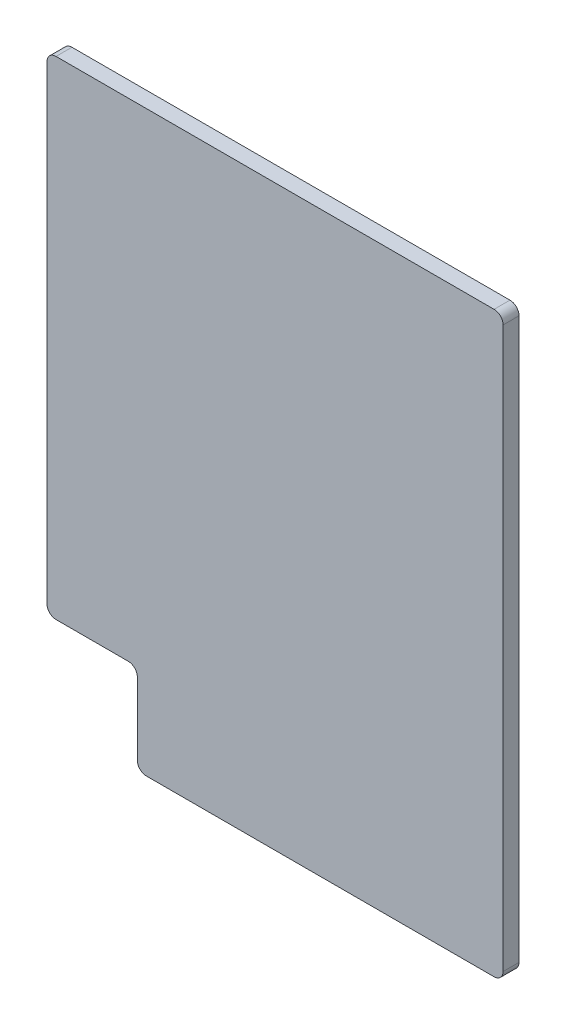
ISO-10303-21;
HEADER;
FILE_DESCRIPTION(('STEP AP214'),'2;1');
FILE_NAME('part.step','',(''),(''),'','','');
FILE_SCHEMA(('AUTOMOTIVE_DESIGN { 1 0 10303 214 1 1 1 1 }'));
ENDSEC;
DATA;
#1=APPLICATION_CONTEXT('core data for automotive mechanical design processes');
#2=APPLICATION_PROTOCOL_DEFINITION('international standard','automotive_design',2000,#1);
#3=PRODUCT_CONTEXT('',#1,'mechanical');
#4=PRODUCT('Part','Part','',(#3));
#5=PRODUCT_RELATED_PRODUCT_CATEGORY('part','',(#4));
#6=PRODUCT_DEFINITION_FORMATION('','',#4);
#7=PRODUCT_DEFINITION_CONTEXT('part definition',#1,'design');
#8=PRODUCT_DEFINITION('design','',#6,#7);
#9=PRODUCT_DEFINITION_SHAPE('','',#8);
#10=(LENGTH_UNIT() NAMED_UNIT(*) SI_UNIT(.MILLI.,.METRE.));
#11=(NAMED_UNIT(*) PLANE_ANGLE_UNIT() SI_UNIT($,.RADIAN.));
#12=(NAMED_UNIT(*) SI_UNIT($,.STERADIAN.) SOLID_ANGLE_UNIT());
#13=UNCERTAINTY_MEASURE_WITH_UNIT(LENGTH_MEASURE(1.E-05),#10,'distance_accuracy_value','');
#14=(GEOMETRIC_REPRESENTATION_CONTEXT(3) GLOBAL_UNCERTAINTY_ASSIGNED_CONTEXT((#13)) GLOBAL_UNIT_ASSIGNED_CONTEXT((#10,
#11,#12)) REPRESENTATION_CONTEXT('',''));
#15=CARTESIAN_POINT('',(0.,0.,0.));
#16=DIRECTION('',(0.,0.,1.));
#17=DIRECTION('',(1.,0.,0.));
#18=AXIS2_PLACEMENT_3D('',#15,#16,#17);
#19=CARTESIAN_POINT('',(31.75,0.,5.588));
#20=DIRECTION('',(-1.,0.,0.));
#21=DIRECTION('',(0.,-1.,0.));
#22=AXIS2_PLACEMENT_3D('',#19,#20,#21);
#23=PLANE('',#22);
#24=DIRECTION('',(0.,1.,0.));
#25=VECTOR('',#24,1.);
#26=CARTESIAN_POINT('',(31.75,0.,0.));
#27=LINE('',#26,#25);
#28=CARTESIAN_POINT('',(31.75,3.175,0.));
#29=VERTEX_POINT('',#28);
#30=CARTESIAN_POINT('',(31.75,28.575,0.));
#31=VERTEX_POINT('',#30);
#32=EDGE_CURVE('E157',#29,#31,#27,.T.);
#33=ORIENTED_EDGE('',*,*,#32,.F.);
#34=DIRECTION('',(0.,0.,-1.));
#35=VECTOR('',#34,1.);
#36=CARTESIAN_POINT('',(31.75,3.175,5.588));
#37=LINE('',#36,#35);
#38=CARTESIAN_POINT('',(31.75,3.175,5.588));
#39=VERTEX_POINT('',#38);
#40=EDGE_CURVE('E188',#29,#39,#37,.F.);
#41=ORIENTED_EDGE('',*,*,#40,.T.);
#42=DIRECTION('',(0.,1.,0.));
#43=VECTOR('',#42,1.);
#44=CARTESIAN_POINT('',(31.75,0.,5.588));
#45=LINE('',#44,#43);
#46=CARTESIAN_POINT('',(31.75,28.575,5.588));
#47=VERTEX_POINT('',#46);
#48=EDGE_CURVE('E165',#39,#47,#45,.T.);
#49=ORIENTED_EDGE('',*,*,#48,.T.);
#50=DIRECTION('',(0.,0.,-1.));
#51=VECTOR('',#50,1.);
#52=CARTESIAN_POINT('',(31.75,28.575,5.588));
#53=LINE('',#52,#51);
#54=EDGE_CURVE('E185',#47,#31,#53,.T.);
#55=ORIENTED_EDGE('',*,*,#54,.T.);
#56=EDGE_LOOP('',(#33,#41,#49,#55));
#57=FACE_BOUND('',#56,.T.);
#58=ADVANCED_FACE('F35',(#57),#23,.T.);
#59=CARTESIAN_POINT('',(0.,0.,5.588));
#60=DIRECTION('',(0.,1.,0.));
#61=DIRECTION('',(0.,0.,1.));
#62=AXIS2_PLACEMENT_3D('',#59,#60,#61);
#63=PLANE('',#62);
#64=DIRECTION('',(1.,0.,0.));
#65=VECTOR('',#64,1.);
#66=CARTESIAN_POINT('',(0.,0.,0.));
#67=LINE('',#66,#65);
#68=CARTESIAN_POINT('',(34.925,0.,0.));
#69=VERTEX_POINT('',#68);
#70=CARTESIAN_POINT('',(157.1625,0.,0.));
#71=VERTEX_POINT('',#70);
#72=EDGE_CURVE('E153',#69,#71,#67,.T.);
#73=ORIENTED_EDGE('',*,*,#72,.T.);
#74=DIRECTION('',(0.,0.,-1.));
#75=VECTOR('',#74,1.);
#76=CARTESIAN_POINT('',(157.1625,0.,5.588));
#77=LINE('',#76,#75);
#78=CARTESIAN_POINT('',(157.1625,0.,5.588));
#79=VERTEX_POINT('',#78);
#80=EDGE_CURVE('E130',#71,#79,#77,.F.);
#81=ORIENTED_EDGE('',*,*,#80,.T.);
#82=DIRECTION('',(1.,0.,0.));
#83=VECTOR('',#82,1.);
#84=CARTESIAN_POINT('',(0.,0.,5.588));
#85=LINE('',#84,#83);
#86=CARTESIAN_POINT('',(34.925,0.,5.588));
#87=VERTEX_POINT('',#86);
#88=EDGE_CURVE('E219',#87,#79,#85,.T.);
#89=ORIENTED_EDGE('',*,*,#88,.F.);
#90=DIRECTION('',(0.,0.,-1.));
#91=VECTOR('',#90,1.);
#92=CARTESIAN_POINT('',(34.925,0.,0.));
#93=LINE('',#92,#91);
#94=EDGE_CURVE('E135',#87,#69,#93,.T.);
#95=ORIENTED_EDGE('',*,*,#94,.T.);
#96=EDGE_LOOP('',(#73,#81,#89,#95));
#97=FACE_BOUND('',#96,.T.);
#98=ADVANCED_FACE('F249',(#97),#63,.F.);
#99=CARTESIAN_POINT('',(160.3375,0.,5.588));
#100=DIRECTION('',(-1.,0.,0.));
#101=DIRECTION('',(0.,0.,1.));
#102=AXIS2_PLACEMENT_3D('',#99,#100,#101);
#103=PLANE('',#102);
#104=DIRECTION('',(0.,1.,0.));
#105=VECTOR('',#104,1.);
#106=CARTESIAN_POINT('',(160.3375,0.,5.588));
#107=LINE('',#106,#105);
#108=CARTESIAN_POINT('',(160.3375,3.175,5.588));
#109=VERTEX_POINT('',#108);
#110=CARTESIAN_POINT('',(160.3375,200.025,5.588));
#111=VERTEX_POINT('',#110);
#112=EDGE_CURVE('E145',#109,#111,#107,.T.);
#113=ORIENTED_EDGE('',*,*,#112,.F.);
#114=DIRECTION('',(0.,0.,-1.));
#115=VECTOR('',#114,1.);
#116=CARTESIAN_POINT('',(160.3375,3.175,5.588));
#117=LINE('',#116,#115);
#118=CARTESIAN_POINT('',(160.3375,3.175,0.));
#119=VERTEX_POINT('',#118);
#120=EDGE_CURVE('E129',#109,#119,#117,.T.);
#121=ORIENTED_EDGE('',*,*,#120,.T.);
#122=DIRECTION('',(0.,1.,0.));
#123=VECTOR('',#122,1.);
#124=CARTESIAN_POINT('',(160.3375,0.,0.));
#125=LINE('',#124,#123);
#126=CARTESIAN_POINT('',(160.3375,200.025,0.));
#127=VERTEX_POINT('',#126);
#128=EDGE_CURVE('E142',#119,#127,#125,.T.);
#129=ORIENTED_EDGE('',*,*,#128,.T.);
#130=DIRECTION('',(0.,0.,-1.));
#131=VECTOR('',#130,1.);
#132=CARTESIAN_POINT('',(160.3375,200.025,5.588));
#133=LINE('',#132,#131);
#134=EDGE_CURVE('E147',#127,#111,#133,.F.);
#135=ORIENTED_EDGE('',*,*,#134,.T.);
#136=EDGE_LOOP('',(#113,#121,#129,#135));
#137=FACE_BOUND('',#136,.T.);
#138=ADVANCED_FACE('F141',(#137),#103,.F.);
#139=CARTESIAN_POINT('',(0.,203.2,5.588));
#140=DIRECTION('',(0.,1.,0.));
#141=DIRECTION('',(0.,0.,1.));
#142=AXIS2_PLACEMENT_3D('',#139,#140,#141);
#143=PLANE('',#142);
#144=DIRECTION('',(1.,0.,0.));
#145=VECTOR('',#144,1.);
#146=CARTESIAN_POINT('',(0.,203.2,5.588));
#147=LINE('',#146,#145);
#148=CARTESIAN_POINT('',(3.175,203.2,5.588));
#149=VERTEX_POINT('',#148);
#150=CARTESIAN_POINT('',(157.1625,203.2,5.588));
#151=VERTEX_POINT('',#150);
#152=EDGE_CURVE('E224',#149,#151,#147,.T.);
#153=ORIENTED_EDGE('',*,*,#152,.T.);
#154=DIRECTION('',(0.,0.,-1.));
#155=VECTOR('',#154,1.);
#156=CARTESIAN_POINT('',(157.1625,203.2,0.));
#157=LINE('',#156,#155);
#158=CARTESIAN_POINT('',(157.1625,203.2,0.));
#159=VERTEX_POINT('',#158);
#160=EDGE_CURVE('E201',#151,#159,#157,.T.);
#161=ORIENTED_EDGE('',*,*,#160,.T.);
#162=DIRECTION('',(1.,0.,0.));
#163=VECTOR('',#162,1.);
#164=CARTESIAN_POINT('',(0.,203.2,0.));
#165=LINE('',#164,#163);
#166=CARTESIAN_POINT('',(3.175,203.2,0.));
#167=VERTEX_POINT('',#166);
#168=EDGE_CURVE('E152',#167,#159,#165,.T.);
#169=ORIENTED_EDGE('',*,*,#168,.F.);
#170=DIRECTION('',(0.,0.,-1.));
#171=VECTOR('',#170,1.);
#172=CARTESIAN_POINT('',(3.175,203.2,5.588));
#173=LINE('',#172,#171);
#174=EDGE_CURVE('E199',#167,#149,#173,.F.);
#175=ORIENTED_EDGE('',*,*,#174,.T.);
#176=EDGE_LOOP('',(#153,#161,#169,#175));
#177=FACE_BOUND('',#176,.T.);
#178=ADVANCED_FACE('F240',(#177),#143,.T.);
#179=CARTESIAN_POINT('',(0.,0.,5.588));
#180=DIRECTION('',(-1.,0.,0.));
#181=DIRECTION('',(0.,0.,1.));
#182=AXIS2_PLACEMENT_3D('',#179,#180,#181);
#183=PLANE('',#182);
#184=DIRECTION('',(0.,1.,0.));
#185=VECTOR('',#184,1.);
#186=CARTESIAN_POINT('',(0.,0.,0.));
#187=LINE('',#186,#185);
#188=CARTESIAN_POINT('',(0.,34.925,0.));
#189=VERTEX_POINT('',#188);
#190=CARTESIAN_POINT('',(0.,200.025,0.));
#191=VERTEX_POINT('',#190);
#192=EDGE_CURVE('E155',#189,#191,#187,.T.);
#193=ORIENTED_EDGE('',*,*,#192,.F.);
#194=DIRECTION('',(0.,0.,-1.));
#195=VECTOR('',#194,1.);
#196=CARTESIAN_POINT('',(0.,34.925,5.588));
#197=LINE('',#196,#195);
#198=CARTESIAN_POINT('',(0.,34.925,5.588));
#199=VERTEX_POINT('',#198);
#200=EDGE_CURVE('E197',#189,#199,#197,.F.);
#201=ORIENTED_EDGE('',*,*,#200,.T.);
#202=DIRECTION('',(0.,1.,0.));
#203=VECTOR('',#202,1.);
#204=CARTESIAN_POINT('',(0.,0.,5.588));
#205=LINE('',#204,#203);
#206=CARTESIAN_POINT('',(0.,200.025,5.588));
#207=VERTEX_POINT('',#206);
#208=EDGE_CURVE('E227',#199,#207,#205,.T.);
#209=ORIENTED_EDGE('',*,*,#208,.T.);
#210=DIRECTION('',(0.,0.,-1.));
#211=VECTOR('',#210,1.);
#212=CARTESIAN_POINT('',(0.,200.025,5.588));
#213=LINE('',#212,#211);
#214=EDGE_CURVE('E194',#207,#191,#213,.T.);
#215=ORIENTED_EDGE('',*,*,#214,.T.);
#216=EDGE_LOOP('',(#193,#201,#209,#215));
#217=FACE_BOUND('',#216,.T.);
#218=ADVANCED_FACE('F233',(#217),#183,.T.);
#219=CARTESIAN_POINT('',(0.,31.75,5.588));
#220=DIRECTION('',(0.,1.,0.));
#221=DIRECTION('',(0.,0.,1.));
#222=AXIS2_PLACEMENT_3D('',#219,#220,#221);
#223=PLANE('',#222);
#224=DIRECTION('',(1.,0.,0.));
#225=VECTOR('',#224,1.);
#226=CARTESIAN_POINT('',(0.,31.75,0.));
#227=LINE('',#226,#225);
#228=CARTESIAN_POINT('',(3.175,31.75,0.));
#229=VERTEX_POINT('',#228);
#230=CARTESIAN_POINT('',(28.575,31.75,0.));
#231=VERTEX_POINT('',#230);
#232=EDGE_CURVE('E163',#229,#231,#227,.T.);
#233=ORIENTED_EDGE('',*,*,#232,.T.);
#234=DIRECTION('',(0.,0.,-1.));
#235=VECTOR('',#234,1.);
#236=CARTESIAN_POINT('',(28.575,31.75,5.588));
#237=LINE('',#236,#235);
#238=CARTESIAN_POINT('',(28.575,31.75,5.588));
#239=VERTEX_POINT('',#238);
#240=EDGE_CURVE('E50',#231,#239,#237,.F.);
#241=ORIENTED_EDGE('',*,*,#240,.T.);
#242=DIRECTION('',(1.,0.,0.));
#243=VECTOR('',#242,1.);
#244=CARTESIAN_POINT('',(0.,31.75,5.588));
#245=LINE('',#244,#243);
#246=CARTESIAN_POINT('',(3.175,31.75,5.588));
#247=VERTEX_POINT('',#246);
#248=EDGE_CURVE('E166',#247,#239,#245,.T.);
#249=ORIENTED_EDGE('',*,*,#248,.F.);
#250=DIRECTION('',(0.,0.,-1.));
#251=VECTOR('',#250,1.);
#252=CARTESIAN_POINT('',(3.175,31.75,0.));
#253=LINE('',#252,#251);
#254=EDGE_CURVE('E190',#247,#229,#253,.T.);
#255=ORIENTED_EDGE('',*,*,#254,.T.);
#256=EDGE_LOOP('',(#233,#241,#249,#255));
#257=FACE_BOUND('',#256,.T.);
#258=ADVANCED_FACE('F208',(#257),#223,.F.);
#259=CARTESIAN_POINT('',(0.,0.,5.588));
#260=DIRECTION('',(0.,0.,1.));
#261=DIRECTION('',(1.,0.,0.));
#262=AXIS2_PLACEMENT_3D('',#259,#260,#261);
#263=PLANE('',#262);
#264=ORIENTED_EDGE('',*,*,#88,.T.);
#265=CARTESIAN_POINT('',(157.1625,3.175,5.588));
#266=DIRECTION('',(0.,0.,1.));
#267=DIRECTION('',(1.,0.,0.));
#268=AXIS2_PLACEMENT_3D('',#265,#266,#267);
#269=CIRCLE('',#268,3.175);
#270=EDGE_CURVE('E183',#79,#109,#269,.T.);
#271=ORIENTED_EDGE('',*,*,#270,.T.);
#272=ORIENTED_EDGE('',*,*,#112,.T.);
#273=CARTESIAN_POINT('',(157.1625,200.025,5.588));
#274=DIRECTION('',(0.,0.,1.));
#275=DIRECTION('',(1.,0.,0.));
#276=AXIS2_PLACEMENT_3D('',#273,#274,#275);
#277=CIRCLE('',#276,3.175);
#278=EDGE_CURVE('E178',#111,#151,#277,.T.);
#279=ORIENTED_EDGE('',*,*,#278,.T.);
#280=ORIENTED_EDGE('',*,*,#152,.F.);
#281=CARTESIAN_POINT('',(3.175,200.025,5.588));
#282=DIRECTION('',(0.,0.,1.));
#283=DIRECTION('',(1.,0.,0.));
#284=AXIS2_PLACEMENT_3D('',#281,#282,#283);
#285=CIRCLE('',#284,3.175);
#286=EDGE_CURVE('E176',#149,#207,#285,.T.);
#287=ORIENTED_EDGE('',*,*,#286,.T.);
#288=ORIENTED_EDGE('',*,*,#208,.F.);
#289=CARTESIAN_POINT('',(3.175,34.925,5.588));
#290=DIRECTION('',(0.,0.,1.));
#291=DIRECTION('',(1.,0.,0.));
#292=AXIS2_PLACEMENT_3D('',#289,#290,#291);
#293=CIRCLE('',#292,3.175);
#294=EDGE_CURVE('E57',#199,#247,#293,.T.);
#295=ORIENTED_EDGE('',*,*,#294,.T.);
#296=ORIENTED_EDGE('',*,*,#248,.T.);
#297=CARTESIAN_POINT('',(28.575,28.575,5.588));
#298=DIRECTION('',(0.,0.,1.));
#299=DIRECTION('',(1.,0.,0.));
#300=AXIS2_PLACEMENT_3D('',#297,#298,#299);
#301=CIRCLE('',#300,3.175);
#302=EDGE_CURVE('E11',#239,#47,#301,.F.);
#303=ORIENTED_EDGE('',*,*,#302,.T.);
#304=ORIENTED_EDGE('',*,*,#48,.F.);
#305=CARTESIAN_POINT('',(34.925,3.175,5.588));
#306=DIRECTION('',(0.,0.,1.));
#307=DIRECTION('',(1.,0.,0.));
#308=AXIS2_PLACEMENT_3D('',#305,#306,#307);
#309=CIRCLE('',#308,3.175);
#310=EDGE_CURVE('E181',#39,#87,#309,.T.);
#311=ORIENTED_EDGE('',*,*,#310,.T.);
#312=EDGE_LOOP('',(#264,#271,#272,#279,#280,#287,#288,#295,#296,#303,#304,#311));
#313=FACE_BOUND('',#312,.T.);
#314=ADVANCED_FACE('F215',(#313),#263,.T.);
#315=CARTESIAN_POINT('',(0.,0.,0.));
#316=DIRECTION('',(0.,0.,1.));
#317=DIRECTION('',(1.,0.,0.));
#318=AXIS2_PLACEMENT_3D('',#315,#316,#317);
#319=PLANE('',#318);
#320=ORIENTED_EDGE('',*,*,#128,.F.);
#321=CARTESIAN_POINT('',(157.1625,3.175,0.));
#322=DIRECTION('',(0.,0.,1.));
#323=DIRECTION('',(1.,0.,0.));
#324=AXIS2_PLACEMENT_3D('',#321,#322,#323);
#325=CIRCLE('',#324,3.175);
#326=EDGE_CURVE('E125',#119,#71,#325,.F.);
#327=ORIENTED_EDGE('',*,*,#326,.T.);
#328=ORIENTED_EDGE('',*,*,#72,.F.);
#329=CARTESIAN_POINT('',(34.925,3.175,0.));
#330=DIRECTION('',(0.,0.,1.));
#331=DIRECTION('',(1.,0.,0.));
#332=AXIS2_PLACEMENT_3D('',#329,#330,#331);
#333=CIRCLE('',#332,3.175);
#334=EDGE_CURVE('E136',#69,#29,#333,.F.);
#335=ORIENTED_EDGE('',*,*,#334,.T.);
#336=ORIENTED_EDGE('',*,*,#32,.T.);
#337=CARTESIAN_POINT('',(28.575,28.575,0.));
#338=DIRECTION('',(0.,0.,1.));
#339=DIRECTION('',(1.,0.,0.));
#340=AXIS2_PLACEMENT_3D('',#337,#338,#339);
#341=CIRCLE('',#340,3.175);
#342=EDGE_CURVE('E43',#31,#231,#341,.T.);
#343=ORIENTED_EDGE('',*,*,#342,.T.);
#344=ORIENTED_EDGE('',*,*,#232,.F.);
#345=CARTESIAN_POINT('',(3.175,34.925,0.));
#346=DIRECTION('',(0.,0.,1.));
#347=DIRECTION('',(1.,0.,0.));
#348=AXIS2_PLACEMENT_3D('',#345,#346,#347);
#349=CIRCLE('',#348,3.175);
#350=EDGE_CURVE('E170',#229,#189,#349,.F.);
#351=ORIENTED_EDGE('',*,*,#350,.T.);
#352=ORIENTED_EDGE('',*,*,#192,.T.);
#353=CARTESIAN_POINT('',(3.175,200.025,0.));
#354=DIRECTION('',(0.,0.,1.));
#355=DIRECTION('',(1.,0.,0.));
#356=AXIS2_PLACEMENT_3D('',#353,#354,#355);
#357=CIRCLE('',#356,3.175);
#358=EDGE_CURVE('E146',#191,#167,#357,.F.);
#359=ORIENTED_EDGE('',*,*,#358,.T.);
#360=ORIENTED_EDGE('',*,*,#168,.T.);
#361=CARTESIAN_POINT('',(157.1625,200.025,0.));
#362=DIRECTION('',(0.,0.,1.));
#363=DIRECTION('',(1.,0.,0.));
#364=AXIS2_PLACEMENT_3D('',#361,#362,#363);
#365=CIRCLE('',#364,3.175);
#366=EDGE_CURVE('E151',#159,#127,#365,.F.);
#367=ORIENTED_EDGE('',*,*,#366,.T.);
#368=EDGE_LOOP('',(#320,#327,#328,#335,#336,#343,#344,#351,#352,#359,#360,#367));
#369=FACE_BOUND('',#368,.T.);
#370=ADVANCED_FACE('F149',(#369),#319,.F.);
#371=CARTESIAN_POINT('',(157.1625,3.175,5.588));
#372=DIRECTION('',(0.,0.,-1.));
#373=DIRECTION('',(-1.,0.,0.));
#374=AXIS2_PLACEMENT_3D('',#371,#372,#373);
#375=CYLINDRICAL_SURFACE('',#374,3.175);
#376=ORIENTED_EDGE('',*,*,#270,.F.);
#377=ORIENTED_EDGE('',*,*,#80,.F.);
#378=ORIENTED_EDGE('',*,*,#326,.F.);
#379=ORIENTED_EDGE('',*,*,#120,.F.);
#380=EDGE_LOOP('',(#376,#377,#378,#379));
#381=FACE_BOUND('',#380,.T.);
#382=ADVANCED_FACE('F128',(#381),#375,.T.);
#383=CARTESIAN_POINT('',(34.925,3.175,5.588));
#384=DIRECTION('',(0.,0.,1.));
#385=DIRECTION('',(1.,0.,0.));
#386=AXIS2_PLACEMENT_3D('',#383,#384,#385);
#387=CYLINDRICAL_SURFACE('',#386,3.175);
#388=ORIENTED_EDGE('',*,*,#310,.F.);
#389=ORIENTED_EDGE('',*,*,#40,.F.);
#390=ORIENTED_EDGE('',*,*,#334,.F.);
#391=ORIENTED_EDGE('',*,*,#94,.F.);
#392=EDGE_LOOP('',(#388,#389,#390,#391));
#393=FACE_BOUND('',#392,.T.);
#394=ADVANCED_FACE('F251',(#393),#387,.T.);
#395=CARTESIAN_POINT('',(28.575,28.575,5.588));
#396=DIRECTION('',(0.,0.,-1.));
#397=DIRECTION('',(-1.,0.,0.));
#398=AXIS2_PLACEMENT_3D('',#395,#396,#397);
#399=CYLINDRICAL_SURFACE('',#398,3.175);
#400=ORIENTED_EDGE('',*,*,#302,.F.);
#401=ORIENTED_EDGE('',*,*,#240,.F.);
#402=ORIENTED_EDGE('',*,*,#342,.F.);
#403=ORIENTED_EDGE('',*,*,#54,.F.);
#404=EDGE_LOOP('',(#400,#401,#402,#403));
#405=FACE_BOUND('',#404,.T.);
#406=ADVANCED_FACE('F211',(#405),#399,.F.);
#407=CARTESIAN_POINT('',(3.175,34.925,5.588));
#408=DIRECTION('',(0.,0.,1.));
#409=DIRECTION('',(1.,0.,0.));
#410=AXIS2_PLACEMENT_3D('',#407,#408,#409);
#411=CYLINDRICAL_SURFACE('',#410,3.175);
#412=ORIENTED_EDGE('',*,*,#294,.F.);
#413=ORIENTED_EDGE('',*,*,#200,.F.);
#414=ORIENTED_EDGE('',*,*,#350,.F.);
#415=ORIENTED_EDGE('',*,*,#254,.F.);
#416=EDGE_LOOP('',(#412,#413,#414,#415));
#417=FACE_BOUND('',#416,.T.);
#418=ADVANCED_FACE('F258',(#417),#411,.T.);
#419=CARTESIAN_POINT('',(157.1625,200.025,5.588));
#420=DIRECTION('',(0.,0.,1.));
#421=DIRECTION('',(1.,0.,0.));
#422=AXIS2_PLACEMENT_3D('',#419,#420,#421);
#423=CYLINDRICAL_SURFACE('',#422,3.175);
#424=ORIENTED_EDGE('',*,*,#278,.F.);
#425=ORIENTED_EDGE('',*,*,#134,.F.);
#426=ORIENTED_EDGE('',*,*,#366,.F.);
#427=ORIENTED_EDGE('',*,*,#160,.F.);
#428=EDGE_LOOP('',(#424,#425,#426,#427));
#429=FACE_BOUND('',#428,.T.);
#430=ADVANCED_FACE('F245',(#429),#423,.T.);
#431=CARTESIAN_POINT('',(3.175,200.025,5.588));
#432=DIRECTION('',(0.,0.,-1.));
#433=DIRECTION('',(-1.,0.,0.));
#434=AXIS2_PLACEMENT_3D('',#431,#432,#433);
#435=CYLINDRICAL_SURFACE('',#434,3.175);
#436=ORIENTED_EDGE('',*,*,#286,.F.);
#437=ORIENTED_EDGE('',*,*,#174,.F.);
#438=ORIENTED_EDGE('',*,*,#358,.F.);
#439=ORIENTED_EDGE('',*,*,#214,.F.);
#440=EDGE_LOOP('',(#436,#437,#438,#439));
#441=FACE_BOUND('',#440,.T.);
#442=ADVANCED_FACE('F37',(#441),#435,.T.);
#443=CLOSED_SHELL('',(#58,#98,#138,#178,#218,#258,#314,#370,#382,#394,#406,#418,#430,#442));
#444=MANIFOLD_SOLID_BREP('B2',#443);
#445=ADVANCED_BREP_SHAPE_REPRESENTATION('',(#18,#444),#14);
#446=SHAPE_DEFINITION_REPRESENTATION(#9,#445);
ENDSEC;
END-ISO-10303-21;
